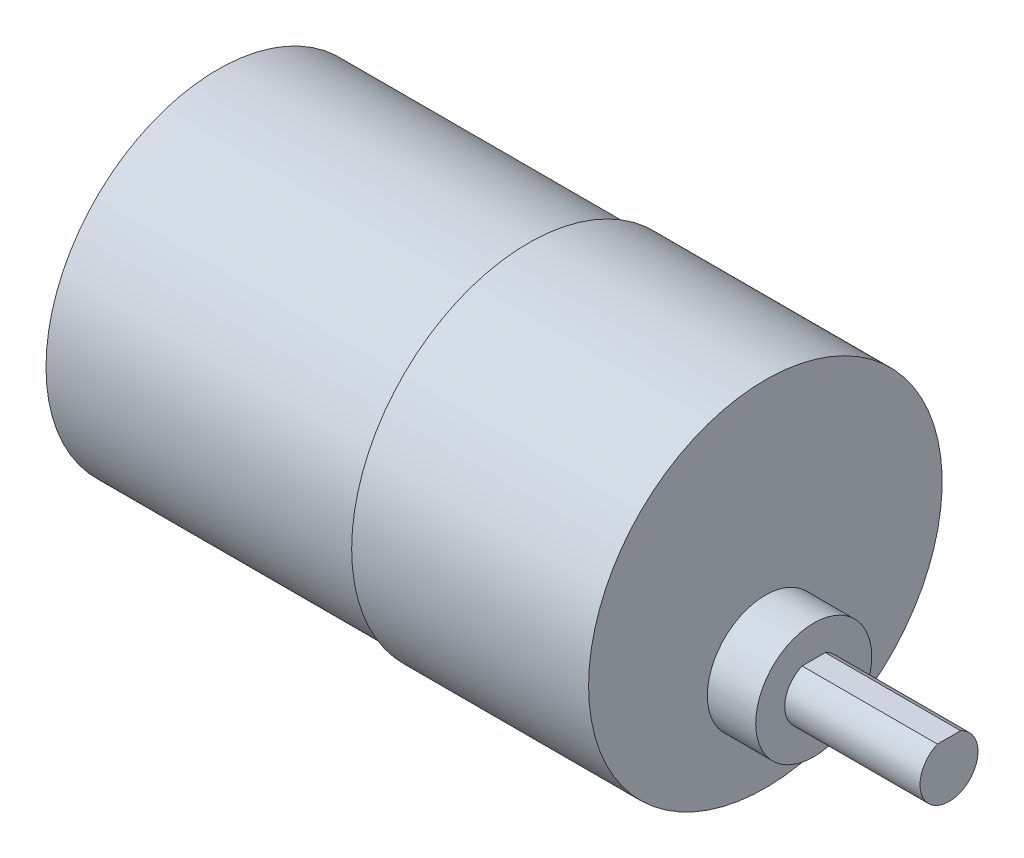
ISO-10303-21;
HEADER;
FILE_DESCRIPTION(('STEP AP214'),'2;1');
FILE_NAME('part.step','',(''),(''),'','','');
FILE_SCHEMA(('AUTOMOTIVE_DESIGN { 1 0 10303 214 1 1 1 1 }'));
ENDSEC;
DATA;
#1=APPLICATION_CONTEXT('core data for automotive mechanical design processes');
#2=APPLICATION_PROTOCOL_DEFINITION('international standard','automotive_design',2000,#1);
#3=PRODUCT_CONTEXT('',#1,'mechanical');
#4=PRODUCT('Part','Part','',(#3));
#5=PRODUCT_RELATED_PRODUCT_CATEGORY('part','',(#4));
#6=PRODUCT_DEFINITION_FORMATION('','',#4);
#7=PRODUCT_DEFINITION_CONTEXT('part definition',#1,'design');
#8=PRODUCT_DEFINITION('design','',#6,#7);
#9=PRODUCT_DEFINITION_SHAPE('','',#8);
#10=(LENGTH_UNIT() NAMED_UNIT(*) SI_UNIT(.MILLI.,.METRE.));
#11=(NAMED_UNIT(*) PLANE_ANGLE_UNIT() SI_UNIT($,.RADIAN.));
#12=(NAMED_UNIT(*) SI_UNIT($,.STERADIAN.) SOLID_ANGLE_UNIT());
#13=UNCERTAINTY_MEASURE_WITH_UNIT(LENGTH_MEASURE(1.E-05),#10,'distance_accuracy_value','');
#14=(GEOMETRIC_REPRESENTATION_CONTEXT(3) GLOBAL_UNCERTAINTY_ASSIGNED_CONTEXT((#13)) GLOBAL_UNIT_ASSIGNED_CONTEXT((#10,
#11,#12)) REPRESENTATION_CONTEXT('',''));
#15=CARTESIAN_POINT('',(0.,0.,0.));
#16=DIRECTION('',(0.,0.,1.));
#17=DIRECTION('',(1.,0.,0.));
#18=AXIS2_PLACEMENT_3D('',#15,#16,#17);
#19=CARTESIAN_POINT('',(-28.321,0.,0.));
#20=DIRECTION('',(-1.,0.,0.));
#21=DIRECTION('',(0.,0.,1.));
#22=AXIS2_PLACEMENT_3D('',#19,#20,#21);
#23=PLANE('',#22);
#24=CARTESIAN_POINT('',(-28.321,0.,0.));
#25=DIRECTION('',(-1.,0.,0.));
#26=DIRECTION('',(0.,0.,1.));
#27=AXIS2_PLACEMENT_3D('',#24,#25,#26);
#28=CIRCLE('',#27,17.78);
#29=CARTESIAN_POINT('',(-28.321,0.,17.78));
#30=VERTEX_POINT('',#29);
#31=EDGE_CURVE('E96',#30,#30,#28,.T.);
#32=ORIENTED_EDGE('',*,*,#31,.T.);
#33=EDGE_LOOP('',(#32));
#34=FACE_BOUND('',#33,.T.);
#35=ADVANCED_FACE('F41',(#34),#23,.T.);
#36=CARTESIAN_POINT('',(28.321,0.,0.));
#37=DIRECTION('',(-1.,0.,0.));
#38=DIRECTION('',(0.,0.,1.));
#39=AXIS2_PLACEMENT_3D('',#36,#37,#38);
#40=PLANE('',#39);
#41=CARTESIAN_POINT('',(28.321,-7.00024,0.));
#42=DIRECTION('',(-1.,0.,0.));
#43=DIRECTION('',(0.,0.,1.));
#44=AXIS2_PLACEMENT_3D('',#41,#42,#43);
#45=CIRCLE('',#44,6.0000007);
#46=CARTESIAN_POINT('',(28.321,-7.00024,6.0000007));
#47=VERTEX_POINT('',#46);
#48=EDGE_CURVE('E11',#47,#47,#45,.F.);
#49=ORIENTED_EDGE('',*,*,#48,.F.);
#50=EDGE_LOOP('',(#49));
#51=FACE_BOUND('',#50,.T.);
#52=CARTESIAN_POINT('',(28.321,0.,0.));
#53=DIRECTION('',(-1.,0.,0.));
#54=DIRECTION('',(0.,0.,1.));
#55=AXIS2_PLACEMENT_3D('',#52,#53,#54);
#56=CIRCLE('',#55,18.288);
#57=CARTESIAN_POINT('',(28.321,0.,18.288));
#58=VERTEX_POINT('',#57);
#59=EDGE_CURVE('E49',#58,#58,#56,.T.);
#60=ORIENTED_EDGE('',*,*,#59,.F.);
#61=EDGE_LOOP('',(#60));
#62=FACE_BOUND('',#61,.T.);
#63=ADVANCED_FACE('F113',(#51,#62),#40,.F.);
#64=CARTESIAN_POINT('',(-37.4495303681899,0.,0.));
#65=DIRECTION('',(-1.,0.,0.));
#66=DIRECTION('',(0.,0.,1.));
#67=AXIS2_PLACEMENT_3D('',#64,#65,#66);
#68=CYLINDRICAL_SURFACE('',#67,18.288);
#69=CARTESIAN_POINT('',(3.80803947010029,0.,0.));
#70=DIRECTION('',(-1.,0.,0.));
#71=DIRECTION('',(0.,0.,1.));
#72=AXIS2_PLACEMENT_3D('',#69,#70,#71);
#73=CIRCLE('',#72,18.288);
#74=CARTESIAN_POINT('',(3.80803947010029,0.,18.288));
#75=VERTEX_POINT('',#74);
#76=EDGE_CURVE('E104',#75,#75,#73,.T.);
#77=ORIENTED_EDGE('',*,*,#76,.F.);
#78=EDGE_LOOP('',(#77));
#79=FACE_BOUND('',#78,.T.);
#80=ORIENTED_EDGE('',*,*,#59,.T.);
#81=EDGE_LOOP('',(#80));
#82=FACE_BOUND('',#81,.T.);
#83=ADVANCED_FACE('F111',(#79,#82),#68,.T.);
#84=CARTESIAN_POINT('',(3.80803947010029,0.,0.));
#85=DIRECTION('',(1.,0.,0.));
#86=DIRECTION('',(0.,0.,-1.));
#87=AXIS2_PLACEMENT_3D('',#84,#85,#86);
#88=PLANE('',#87);
#89=CARTESIAN_POINT('',(3.80803947010029,0.,0.));
#90=DIRECTION('',(-1.,0.,0.));
#91=DIRECTION('',(0.,0.,1.));
#92=AXIS2_PLACEMENT_3D('',#89,#90,#91);
#93=CIRCLE('',#92,17.78);
#94=CARTESIAN_POINT('',(3.80803947010029,0.,17.78));
#95=VERTEX_POINT('',#94);
#96=EDGE_CURVE('E100',#95,#95,#93,.T.);
#97=ORIENTED_EDGE('',*,*,#96,.F.);
#98=EDGE_LOOP('',(#97));
#99=FACE_BOUND('',#98,.T.);
#100=ORIENTED_EDGE('',*,*,#76,.T.);
#101=EDGE_LOOP('',(#100));
#102=FACE_BOUND('',#101,.T.);
#103=ADVANCED_FACE('F120',(#99,#102),#88,.F.);
#104=CARTESIAN_POINT('',(-37.4495303681899,0.,0.));
#105=DIRECTION('',(-1.,0.,0.));
#106=DIRECTION('',(0.,0.,1.));
#107=AXIS2_PLACEMENT_3D('',#104,#105,#106);
#108=CYLINDRICAL_SURFACE('',#107,17.78);
#109=ORIENTED_EDGE('',*,*,#31,.F.);
#110=EDGE_LOOP('',(#109));
#111=FACE_BOUND('',#110,.T.);
#112=ORIENTED_EDGE('',*,*,#96,.T.);
#113=EDGE_LOOP('',(#112));
#114=FACE_BOUND('',#113,.T.);
#115=ADVANCED_FACE('F128',(#111,#114),#108,.T.);
#116=CARTESIAN_POINT('',(33.32099,-7.00024,0.));
#117=DIRECTION('',(-1.,0.,0.));
#118=DIRECTION('',(0.,0.,1.));
#119=AXIS2_PLACEMENT_3D('',#116,#117,#118);
#120=CYLINDRICAL_SURFACE('',#119,6.0000007);
#121=CARTESIAN_POINT('',(33.32099,-7.00024,0.));
#122=DIRECTION('',(1.,0.,0.));
#123=DIRECTION('',(0.,0.,-1.));
#124=AXIS2_PLACEMENT_3D('',#121,#122,#123);
#125=CIRCLE('',#124,6.0000007);
#126=CARTESIAN_POINT('',(33.32099,-7.00024,-6.0000007));
#127=VERTEX_POINT('',#126);
#128=EDGE_CURVE('E89',#127,#127,#125,.T.);
#129=ORIENTED_EDGE('',*,*,#128,.F.);
#130=EDGE_LOOP('',(#129));
#131=FACE_BOUND('',#130,.T.);
#132=ORIENTED_EDGE('',*,*,#48,.T.);
#133=EDGE_LOOP('',(#132));
#134=FACE_BOUND('',#133,.T.);
#135=ADVANCED_FACE('F132',(#131,#134),#120,.T.);
#136=CARTESIAN_POINT('',(33.32099,0.,0.));
#137=DIRECTION('',(1.,0.,0.));
#138=DIRECTION('',(0.,0.,-1.));
#139=AXIS2_PLACEMENT_3D('',#136,#137,#138);
#140=PLANE('',#139);
#141=CARTESIAN_POINT('',(33.32099,-7.00024,0.));
#142=DIRECTION('',(1.,0.,0.));
#143=DIRECTION('',(0.,0.,-1.));
#144=AXIS2_PLACEMENT_3D('',#141,#142,#143);
#145=CIRCLE('',#144,2.999994);
#146=CARTESIAN_POINT('',(33.32099,-4.2502455,1.19895548291242));
#147=VERTEX_POINT('',#146);
#148=CARTESIAN_POINT('',(33.32099,-4.2502455,-1.19895548291242));
#149=VERTEX_POINT('',#148);
#150=EDGE_CURVE('E68',#147,#149,#145,.T.);
#151=ORIENTED_EDGE('',*,*,#150,.F.);
#152=DIRECTION('',(0.,0.,1.));
#153=VECTOR('',#152,1.);
#154=CARTESIAN_POINT('',(33.32099,-4.2502455,1.19895548291242));
#155=LINE('',#154,#153);
#156=EDGE_CURVE('E55',#149,#147,#155,.T.);
#157=ORIENTED_EDGE('',*,*,#156,.F.);
#158=EDGE_LOOP('',(#151,#157));
#159=FACE_BOUND('',#158,.T.);
#160=ORIENTED_EDGE('',*,*,#128,.T.);
#161=EDGE_LOOP('',(#160));
#162=FACE_BOUND('',#161,.T.);
#163=ADVANCED_FACE('F69',(#159,#162),#140,.T.);
#164=CARTESIAN_POINT('',(47.3209874,-7.00024,0.));
#165=DIRECTION('',(-1.,0.,0.));
#166=DIRECTION('',(0.,0.,1.));
#167=AXIS2_PLACEMENT_3D('',#164,#165,#166);
#168=CYLINDRICAL_SURFACE('',#167,2.999994);
#169=ORIENTED_EDGE('',*,*,#150,.T.);
#170=DIRECTION('',(-1.,0.,0.));
#171=VECTOR('',#170,1.);
#172=CARTESIAN_POINT('',(47.3209874,-4.2502455,-1.19895548291242));
#173=LINE('',#172,#171);
#174=CARTESIAN_POINT('',(47.3209874,-4.2502455,-1.19895548291242));
#175=VERTEX_POINT('',#174);
#176=EDGE_CURVE('E80',#175,#149,#173,.T.);
#177=ORIENTED_EDGE('',*,*,#176,.F.);
#178=CARTESIAN_POINT('',(47.3209874,-7.00024,0.));
#179=DIRECTION('',(1.,0.,0.));
#180=DIRECTION('',(0.,0.,-1.));
#181=AXIS2_PLACEMENT_3D('',#178,#179,#180);
#182=CIRCLE('',#181,2.999994);
#183=CARTESIAN_POINT('',(47.3209874,-4.2502455,1.19895548291242));
#184=VERTEX_POINT('',#183);
#185=EDGE_CURVE('E82',#184,#175,#182,.T.);
#186=ORIENTED_EDGE('',*,*,#185,.F.);
#187=DIRECTION('',(-1.,0.,0.));
#188=VECTOR('',#187,1.);
#189=CARTESIAN_POINT('',(47.3209874,-4.2502455,1.19895548291242));
#190=LINE('',#189,#188);
#191=EDGE_CURVE('E78',#184,#147,#190,.T.);
#192=ORIENTED_EDGE('',*,*,#191,.T.);
#193=EDGE_LOOP('',(#169,#177,#186,#192));
#194=FACE_BOUND('',#193,.T.);
#195=ADVANCED_FACE('F84',(#194),#168,.T.);
#196=CARTESIAN_POINT('',(47.3209874,-4.2502455,1.19895548291242));
#197=DIRECTION('',(0.,-1.,0.));
#198=DIRECTION('',(0.,0.,-1.));
#199=AXIS2_PLACEMENT_3D('',#196,#197,#198);
#200=PLANE('',#199);
#201=ORIENTED_EDGE('',*,*,#156,.T.);
#202=ORIENTED_EDGE('',*,*,#191,.F.);
#203=DIRECTION('',(0.,0.,1.));
#204=VECTOR('',#203,1.);
#205=CARTESIAN_POINT('',(47.3209874,-4.2502455,1.19895548291242));
#206=LINE('',#205,#204);
#207=EDGE_CURVE('E63',#175,#184,#206,.T.);
#208=ORIENTED_EDGE('',*,*,#207,.F.);
#209=ORIENTED_EDGE('',*,*,#176,.T.);
#210=EDGE_LOOP('',(#201,#202,#208,#209));
#211=FACE_BOUND('',#210,.T.);
#212=ADVANCED_FACE('F77',(#211),#200,.F.);
#213=CARTESIAN_POINT('',(47.3209874,-7.00024,0.));
#214=DIRECTION('',(1.,0.,0.));
#215=DIRECTION('',(0.,0.,-1.));
#216=AXIS2_PLACEMENT_3D('',#213,#214,#215);
#217=PLANE('',#216);
#218=ORIENTED_EDGE('',*,*,#185,.T.);
#219=ORIENTED_EDGE('',*,*,#207,.T.);
#220=EDGE_LOOP('',(#218,#219));
#221=FACE_BOUND('',#220,.T.);
#222=ADVANCED_FACE('F143',(#221),#217,.T.);
#223=CLOSED_SHELL('',(#35,#63,#83,#103,#115,#135,#163,#195,#212,#222));
#224=MANIFOLD_SOLID_BREP('B2',#223);
#225=ADVANCED_BREP_SHAPE_REPRESENTATION('',(#18,#224),#14);
#226=SHAPE_DEFINITION_REPRESENTATION(#9,#225);
ENDSEC;
END-ISO-10303-21;
